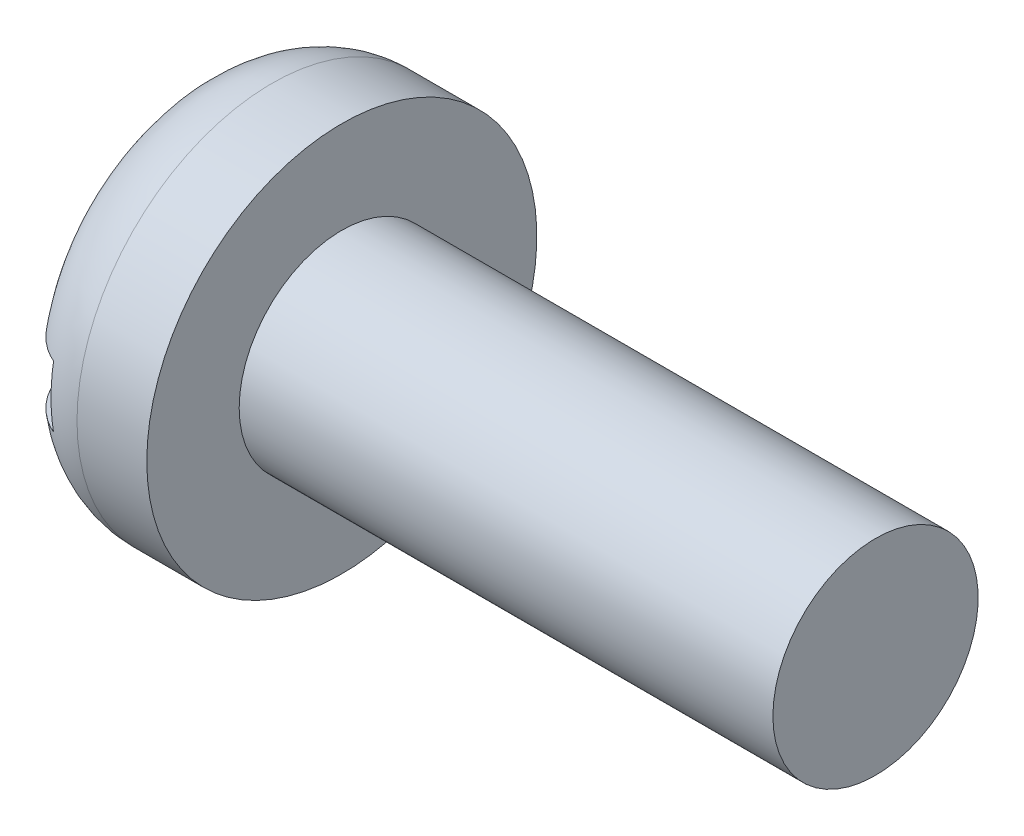
ISO-10303-21;
HEADER;
FILE_DESCRIPTION(('STEP AP214'),'2;1');
FILE_NAME('part.step','',(''),(''),'','','');
FILE_SCHEMA(('AUTOMOTIVE_DESIGN { 1 0 10303 214 1 1 1 1 }'));
ENDSEC;
DATA;
#1=APPLICATION_CONTEXT('core data for automotive mechanical design processes');
#2=APPLICATION_PROTOCOL_DEFINITION('international standard','automotive_design',2000,#1);
#3=PRODUCT_CONTEXT('',#1,'mechanical');
#4=PRODUCT('Part','Part','',(#3));
#5=PRODUCT_RELATED_PRODUCT_CATEGORY('part','',(#4));
#6=PRODUCT_DEFINITION_FORMATION('','',#4);
#7=PRODUCT_DEFINITION_CONTEXT('part definition',#1,'design');
#8=PRODUCT_DEFINITION('design','',#6,#7);
#9=PRODUCT_DEFINITION_SHAPE('','',#8);
#10=(LENGTH_UNIT() NAMED_UNIT(*) SI_UNIT(.MILLI.,.METRE.));
#11=(NAMED_UNIT(*) PLANE_ANGLE_UNIT() SI_UNIT($,.RADIAN.));
#12=(NAMED_UNIT(*) SI_UNIT($,.STERADIAN.) SOLID_ANGLE_UNIT());
#13=UNCERTAINTY_MEASURE_WITH_UNIT(LENGTH_MEASURE(1.E-05),#10,'distance_accuracy_value','');
#14=(GEOMETRIC_REPRESENTATION_CONTEXT(3) GLOBAL_UNCERTAINTY_ASSIGNED_CONTEXT((#13)) GLOBAL_UNIT_ASSIGNED_CONTEXT((#10,
#11,#12)) REPRESENTATION_CONTEXT('',''));
#15=CARTESIAN_POINT('',(0.,0.,0.));
#16=DIRECTION('',(0.,0.,1.));
#17=DIRECTION('',(1.,0.,0.));
#18=AXIS2_PLACEMENT_3D('',#15,#16,#17);
#19=CARTESIAN_POINT('',(-34.1560212530234,7.15217082981992,13.1645875920142));
#20=DIRECTION('',(-1.,0.,0.));
#21=DIRECTION('',(0.,0.,1.));
#22=AXIS2_PLACEMENT_3D('',#19,#20,#21);
#23=PLANE('',#22);
#24=DIRECTION('',(0.,0.,-1.));
#25=VECTOR('',#24,1.);
#26=CARTESIAN_POINT('',(-34.1560212530234,7.90217082981992,17.9145875920142));
#27=LINE('',#26,#25);
#28=CARTESIAN_POINT('',(-34.1560212530234,7.90217082981992,15.8103389030788));
#29=VERTEX_POINT('',#28);
#30=CARTESIAN_POINT('',(-34.1560212530234,7.90217082981992,10.5188362809496));
#31=VERTEX_POINT('',#30);
#32=EDGE_CURVE('E94',#29,#31,#27,.T.);
#33=ORIENTED_EDGE('',*,*,#32,.F.);
#34=CARTESIAN_POINT('',(-34.1560212530234,7.15217082981992,13.1645875920142));
#35=DIRECTION('',(-1.,0.,0.));
#36=DIRECTION('',(0.,0.,1.));
#37=AXIS2_PLACEMENT_3D('',#34,#35,#36);
#38=CIRCLE('',#37,2.75);
#39=EDGE_CURVE('E101',#29,#31,#38,.T.);
#40=ORIENTED_EDGE('',*,*,#39,.T.);
#41=EDGE_LOOP('',(#33,#40));
#42=FACE_BOUND('',#41,.T.);
#43=ADVANCED_FACE('F39',(#42),#23,.T.);
#44=CARTESIAN_POINT('',(-59.5560212530234,7.15217082981992,13.1645875920142));
#45=DIRECTION('',(-1.,0.,0.));
#46=DIRECTION('',(0.,0.,1.));
#47=AXIS2_PLACEMENT_3D('',#44,#45,#46);
#48=CYLINDRICAL_SURFACE('',#47,2.5);
#49=CARTESIAN_POINT('',(-17.4560212530234,7.15217082981992,13.1645875920142));
#50=DIRECTION('',(-1.,0.,0.));
#51=DIRECTION('',(0.,0.,1.));
#52=AXIS2_PLACEMENT_3D('',#49,#50,#51);
#53=CIRCLE('',#52,2.5);
#54=CARTESIAN_POINT('',(-17.4560212530234,7.15217082981992,15.6645875920142));
#55=VERTEX_POINT('',#54);
#56=EDGE_CURVE('E105',#55,#55,#53,.T.);
#57=ORIENTED_EDGE('',*,*,#56,.T.);
#58=EDGE_LOOP('',(#57));
#59=FACE_BOUND('',#58,.T.);
#60=CARTESIAN_POINT('',(-30.4560212530234,7.15217082981992,13.1645875920142));
#61=DIRECTION('',(-1.,0.,0.));
#62=DIRECTION('',(0.,0.,1.));
#63=AXIS2_PLACEMENT_3D('',#60,#61,#62);
#64=CIRCLE('',#63,2.5);
#65=CARTESIAN_POINT('',(-30.4560212530234,7.15217082981992,15.6645875920142));
#66=VERTEX_POINT('',#65);
#67=EDGE_CURVE('E174',#66,#66,#64,.T.);
#68=ORIENTED_EDGE('',*,*,#67,.F.);
#69=EDGE_LOOP('',(#68));
#70=FACE_BOUND('',#69,.T.);
#71=ADVANCED_FACE('F41',(#59,#70),#48,.T.);
#72=CARTESIAN_POINT('',(-17.4560212530234,9.65217082981992,13.1645875920142));
#73=DIRECTION('',(1.,0.,0.));
#74=DIRECTION('',(0.,0.,-1.));
#75=AXIS2_PLACEMENT_3D('',#72,#73,#74);
#76=PLANE('',#75);
#77=ORIENTED_EDGE('',*,*,#56,.F.);
#78=EDGE_LOOP('',(#77));
#79=FACE_BOUND('',#78,.T.);
#80=ADVANCED_FACE('F160',(#79),#76,.T.);
#81=DIRECTION('',(0.,0.,1.));
#82=VECTOR('',#81,1.);
#83=CARTESIAN_POINT('',(-34.1560212530234,6.40217082981992,8.41458759201424));
#84=LINE('',#83,#82);
#85=CARTESIAN_POINT('',(-34.1560212530234,6.40217082981992,10.5188362809497));
#86=VERTEX_POINT('',#85);
#87=CARTESIAN_POINT('',(-34.1560212530234,6.40217082981992,15.8103389030788));
#88=VERTEX_POINT('',#87);
#89=EDGE_CURVE('E85',#86,#88,#84,.T.);
#90=ORIENTED_EDGE('',*,*,#89,.F.);
#91=EDGE_CURVE('E92',#86,#88,#38,.T.);
#92=ORIENTED_EDGE('',*,*,#91,.T.);
#93=EDGE_LOOP('',(#90,#92));
#94=FACE_BOUND('',#93,.T.);
#95=ADVANCED_FACE('F91',(#94),#23,.T.);
#96=CARTESIAN_POINT('',(-32.1560212530234,7.15217082981992,13.1645875920142));
#97=DIRECTION('',(-1.,0.,0.));
#98=DIRECTION('',(0.,0.,1.));
#99=AXIS2_PLACEMENT_3D('',#96,#97,#98);
#100=TOROIDAL_SURFACE('',#99,2.75,2.);
#101=CARTESIAN_POINT('',(-32.1560212530234,7.90217082981992,13.1645875920142));
#102=CARTESIAN_POINT('',(-32.1585637933892,7.90217082981992,13.1630306328107));
#103=CARTESIAN_POINT('',(-32.1611063606378,7.90217082981992,13.1614736343376));
#104=CARTESIAN_POINT('',(-32.3775258735326,7.90217082981987,13.0289397618987));
#105=CARTESIAN_POINT('',(-32.5914875932781,7.90217082981991,12.8975372468939));
#106=CARTESIAN_POINT('',(-32.8990380550231,7.90217082981992,12.6812934608708));
#107=CARTESIAN_POINT('',(-32.9992240425318,7.90217082981992,12.6061117048243));
#108=CARTESIAN_POINT('',(-33.1925480933318,7.90217082981992,12.4472457905427));
#109=CARTESIAN_POINT('',(-33.2856925687357,7.90217082981992,12.363569534291));
#110=CARTESIAN_POINT('',(-33.4777345499212,7.90217082981992,12.1707137121062));
#111=CARTESIAN_POINT('',(-33.5747688275179,7.90217082981992,12.059636142358));
#112=CARTESIAN_POINT('',(-33.7505053794897,7.90217082981992,11.8235129442776));
#113=CARTESIAN_POINT('',(-33.8291958368805,7.90217082981992,11.698458388358));
#114=CARTESIAN_POINT('',(-33.964086279289,7.90217082981992,11.4352870494449));
#115=CARTESIAN_POINT('',(-34.0200950377302,7.90217082981992,11.2970708646883));
#116=CARTESIAN_POINT('',(-34.1046798733994,7.90217082981992,11.012434329591));
#117=CARTESIAN_POINT('',(-34.1332737178728,7.90217082981992,10.8660193579953));
#118=CARTESIAN_POINT('',(-34.1589088663038,7.90217082981992,10.5870706758641));
#119=CARTESIAN_POINT('',(-34.1591369045153,7.90217082981992,10.4548276022557));
#120=CARTESIAN_POINT('',(-34.1351518645423,7.90217082981992,10.1925638392498));
#121=CARTESIAN_POINT('',(-34.1109506047191,7.90217082981992,10.062542106147));
#122=CARTESIAN_POINT('',(-34.0416030051228,7.90217082981992,9.82055508940338));
#123=CARTESIAN_POINT('',(-33.9984809331208,7.90217082981992,9.70800652510776));
#124=CARTESIAN_POINT('',(-33.8931714110885,7.90217082981992,9.49221976469486));
#125=CARTESIAN_POINT('',(-33.8309905453412,7.90217082981992,9.3889783691255));
#126=CARTESIAN_POINT('',(-33.6922033397545,7.90217082981992,9.19912243556574));
#127=CARTESIAN_POINT('',(-33.616288795508,7.90217082981992,9.11200149619686));
#128=CARTESIAN_POINT('',(-33.4506285237545,7.90217082981992,8.95207081496302));
#129=CARTESIAN_POINT('',(-33.3608835193194,7.90217082981992,8.87926032538432));
#130=CARTESIAN_POINT('',(-33.1721453795432,7.90217082981992,8.7515582473592));
#131=CARTESIAN_POINT('',(-33.0733813136964,7.90217082981992,8.69632788160799));
#132=CARTESIAN_POINT('',(-32.8679279969552,7.90217082981992,8.60344440225547));
#133=CARTESIAN_POINT('',(-32.7612406029192,7.90217082981992,8.56578718530114));
#134=CARTESIAN_POINT('',(-32.5441651705313,7.90217082981992,8.50947895546948));
#135=CARTESIAN_POINT('',(-32.433828084167,7.90217082981992,8.49063150951292));
#136=CARTESIAN_POINT('',(-32.2115463631959,7.90217082981992,8.47180212956621));
#137=CARTESIAN_POINT('',(-32.0996014275652,7.90217082981992,8.47182377555441));
#138=CARTESIAN_POINT('',(-31.8777751021335,7.90217082981992,8.49072301837474));
#139=CARTESIAN_POINT('',(-31.7678866268686,7.90217082981992,8.50951456950833));
#140=CARTESIAN_POINT('',(-31.6066491535148,7.90217082981992,8.55128177717353));
#141=CARTESIAN_POINT('',(-31.5534620316616,7.90217082981992,8.56748563534195));
#142=CARTESIAN_POINT('',(-31.448634863689,7.90217082981992,8.60430445625569));
#143=CARTESIAN_POINT('',(-31.396994872624,7.90217082981992,8.62491957576286));
#144=CARTESIAN_POINT('',(-31.3462885975344,7.90217082981992,8.64767849982155));
#145=B_SPLINE_CURVE_WITH_KNOTS('',3,(#101,#102,#103,#104,#105,#106,#107,#108,#109,#110,#111,
#112,#113,#114,#115,#116,#117,#118,#119,#120,#121,#122,#123,#124,#125,#126,#127,#128,#129,#130,
#131,#132,#133,#134,#135,#136,#137,#138,#139,#140,#141,#142,#143,#144),.UNSPECIFIED.,.F.,.F.,(4,
2,2,2,2,2,2,2,2,2,2,2,2,2,2,2,2,2,2,2,2,4),(0.,0.00894427191004238,0.76131942963517,
1.13671453952374,1.51176358473608,1.95268955931189,2.3938987957597,2.83875402308001,
3.28332075030153,3.67789205033982,4.07227255683468,4.43204639630518,4.79169608375181,
5.13667709031289,5.4816400669968,5.81948418397834,6.15724937439949,6.49144912103186,
6.82571227443123,7.15845008678029,7.32508190046574,7.49171963668609),.UNSPECIFIED.);
#146=CARTESIAN_POINT('',(-32.9560212530234,7.90217082981992,8.64334146634238));
#147=VERTEX_POINT('',#146);
#148=EDGE_CURVE('E11',#31,#147,#145,.T.);
#149=ORIENTED_EDGE('',*,*,#148,.F.);
#150=ORIENTED_EDGE('',*,*,#39,.F.);
#151=CARTESIAN_POINT('',(-32.1560212530234,7.90217082981992,13.1645875920142));
#152=CARTESIAN_POINT('',(-32.1585637933892,7.90217082981992,13.1661445512177));
#153=CARTESIAN_POINT('',(-32.1611063606378,7.90217082981992,13.1677015496909));
#154=CARTESIAN_POINT('',(-32.3775258735326,7.90217082981987,13.3002354221298));
#155=CARTESIAN_POINT('',(-32.5914875932781,7.90217082981991,13.4316379371346));
#156=CARTESIAN_POINT('',(-32.8990380550231,7.90217082981992,13.6478817231577));
#157=CARTESIAN_POINT('',(-32.9992240425318,7.90217082981992,13.7230634792041));
#158=CARTESIAN_POINT('',(-33.1925480933319,7.90217082981992,13.8819293934858));
#159=CARTESIAN_POINT('',(-33.2856925687357,7.90217082981992,13.9656056497375));
#160=CARTESIAN_POINT('',(-33.4777345499212,7.90217082981992,14.1584614719223));
#161=CARTESIAN_POINT('',(-33.5747688275179,7.90217082981992,14.2695390416704));
#162=CARTESIAN_POINT('',(-33.7505053794897,7.90217082981992,14.5056622397508));
#163=CARTESIAN_POINT('',(-33.8291958368805,7.90217082981992,14.6307167956704));
#164=CARTESIAN_POINT('',(-33.964086279289,7.90217082981992,14.8938881345835));
#165=CARTESIAN_POINT('',(-34.0200950377302,7.90217082981992,15.0321043193402));
#166=CARTESIAN_POINT('',(-34.1046798733994,7.90217082981992,15.3167408544375));
#167=CARTESIAN_POINT('',(-34.1332737178728,7.90217082981992,15.4631558260332));
#168=CARTESIAN_POINT('',(-34.1589088663038,7.90217082981992,15.7421045081644));
#169=CARTESIAN_POINT('',(-34.1591369045153,7.90217082981992,15.8743475817727));
#170=CARTESIAN_POINT('',(-34.1351518645423,7.90217082981992,16.1366113447787));
#171=CARTESIAN_POINT('',(-34.1109506047191,7.90217082981992,16.2666330778815));
#172=CARTESIAN_POINT('',(-34.0416030051228,7.90217082981992,16.5086200946251));
#173=CARTESIAN_POINT('',(-33.9984809331208,7.90217082981992,16.6211686589207));
#174=CARTESIAN_POINT('',(-33.8931714110885,7.90217082981992,16.8369554193336));
#175=CARTESIAN_POINT('',(-33.8309905453412,7.90217082981992,16.940196814903));
#176=CARTESIAN_POINT('',(-33.6922033397545,7.90217082981992,17.1300527484627));
#177=CARTESIAN_POINT('',(-33.616288795508,7.90217082981992,17.2171736878316));
#178=CARTESIAN_POINT('',(-33.4506285237545,7.90217082981992,17.3771043690655));
#179=CARTESIAN_POINT('',(-33.3608835193194,7.90217082981992,17.4499148586442));
#180=CARTESIAN_POINT('',(-33.1721453795432,7.90217082981992,17.5776169366693));
#181=CARTESIAN_POINT('',(-33.0733813136964,7.90217082981992,17.6328473024205));
#182=CARTESIAN_POINT('',(-32.8679279969552,7.90217082981992,17.725730781773));
#183=CARTESIAN_POINT('',(-32.7612406029192,7.90217082981992,17.7633879987273));
#184=CARTESIAN_POINT('',(-32.5441651705313,7.90217082981992,17.819696228559));
#185=CARTESIAN_POINT('',(-32.433828084167,7.90217082981992,17.8385436745156));
#186=CARTESIAN_POINT('',(-32.2115463631959,7.90217082981992,17.8573730544623));
#187=CARTESIAN_POINT('',(-32.0996014275652,7.90217082981992,17.8573514084741));
#188=CARTESIAN_POINT('',(-31.8777751021335,7.90217082981992,17.8384521656537));
#189=CARTESIAN_POINT('',(-31.7678866268686,7.90217082981992,17.8196606145202));
#190=CARTESIAN_POINT('',(-31.6066491535148,7.90217082981992,17.777893406855));
#191=CARTESIAN_POINT('',(-31.5534620316616,7.90217082981992,17.7616895486865));
#192=CARTESIAN_POINT('',(-31.448634863689,7.90217082981992,17.7248707277728));
#193=CARTESIAN_POINT('',(-31.396994872624,7.90217082981992,17.7042556082656));
#194=CARTESIAN_POINT('',(-31.3462885975344,7.90217082981992,17.6814966842069));
#195=B_SPLINE_CURVE_WITH_KNOTS('',3,(#151,#152,#153,#154,#155,#156,#157,#158,#159,#160,#161,
#162,#163,#164,#165,#166,#167,#168,#169,#170,#171,#172,#173,#174,#175,#176,#177,#178,#179,#180,
#181,#182,#183,#184,#185,#186,#187,#188,#189,#190,#191,#192,#193,#194),.UNSPECIFIED.,.F.,.F.,(4,
2,2,2,2,2,2,2,2,2,2,2,2,2,2,2,2,2,2,2,2,4),(0.,0.00894427191004238,0.76131942963517,
1.13671453952375,1.51176358473608,1.95268955931189,2.3938987957597,2.83875402308001,
3.28332075030153,3.67789205033982,4.07227255683468,4.43204639630519,4.79169608375181,
5.13667709031289,5.4816400669968,5.81948418397834,6.15724937439949,6.49144912103186,
6.82571227443123,7.1584500867803,7.32508190046574,7.49171963668609),.UNSPECIFIED.);
#196=CARTESIAN_POINT('',(-32.9560212530234,7.90217082981992,17.6858337176861));
#197=VERTEX_POINT('',#196);
#198=EDGE_CURVE('E121',#197,#29,#195,.F.);
#199=ORIENTED_EDGE('',*,*,#198,.F.);
#200=CARTESIAN_POINT('',(-32.9560212530234,7.15217082981992,13.1645875920142));
#201=DIRECTION('',(-1.,0.,0.));
#202=DIRECTION('',(0.,0.,1.));
#203=AXIS2_PLACEMENT_3D('',#200,#201,#202);
#204=CIRCLE('',#203,4.58303027798234);
#205=CARTESIAN_POINT('',(-32.9560212530234,6.40217082981992,17.6858337176861));
#206=VERTEX_POINT('',#205);
#207=EDGE_CURVE('E113',#197,#206,#204,.F.);
#208=ORIENTED_EDGE('',*,*,#207,.T.);
#209=CARTESIAN_POINT('',(-32.1560212530234,6.40217082981992,13.1645875920142));
#210=CARTESIAN_POINT('',(-32.1585637933892,6.40217082981992,13.1661445512177));
#211=CARTESIAN_POINT('',(-32.1611063606378,6.40217082981992,13.1677015496908));
#212=CARTESIAN_POINT('',(-32.3775258735338,6.40217082981992,13.3002354221273));
#213=CARTESIAN_POINT('',(-32.5914875932778,6.40217082981992,13.4316379371339));
#214=CARTESIAN_POINT('',(-32.8990380550222,6.40217082981992,13.6478817231574));
#215=CARTESIAN_POINT('',(-32.999224042531,6.40217082981992,13.7230634792036));
#216=CARTESIAN_POINT('',(-33.192548093331,6.40217082981992,13.881929393485));
#217=CARTESIAN_POINT('',(-33.2856925687348,6.40217082981992,13.9656056497366));
#218=CARTESIAN_POINT('',(-33.4777345499203,6.40217082981992,14.1584614719214));
#219=CARTESIAN_POINT('',(-33.5747688275172,6.40217082981992,14.2695390416695));
#220=CARTESIAN_POINT('',(-33.7505053794891,6.40217082981992,14.5056622397499));
#221=CARTESIAN_POINT('',(-33.8291958368799,6.40217082981992,14.6307167956695));
#222=CARTESIAN_POINT('',(-33.9640862792886,6.40217082981992,14.8938881345826));
#223=CARTESIAN_POINT('',(-34.0200950377298,6.40217082981992,15.0321043193392));
#224=CARTESIAN_POINT('',(-34.1046798733992,6.40217082981992,15.3167408544366));
#225=CARTESIAN_POINT('',(-34.1332737178726,6.40217082981992,15.4631558260324));
#226=CARTESIAN_POINT('',(-34.1589088663037,6.40217082981992,15.7421045081636));
#227=CARTESIAN_POINT('',(-34.1591369045153,6.40217082981992,15.874347581772));
#228=CARTESIAN_POINT('',(-34.1351518645424,6.40217082981992,16.136611344778));
#229=CARTESIAN_POINT('',(-34.1109506047192,6.40217082981992,16.2666330778809));
#230=CARTESIAN_POINT('',(-34.041603005123,6.40217082981992,16.5086200946245));
#231=CARTESIAN_POINT('',(-33.998480933121,6.40217082981992,16.6211686589201));
#232=CARTESIAN_POINT('',(-33.8931714110888,6.40217082981992,16.8369554193331));
#233=CARTESIAN_POINT('',(-33.8309905453416,6.40217082981992,16.9401968149025));
#234=CARTESIAN_POINT('',(-33.6922033397549,6.40217082981992,17.1300527484623));
#235=CARTESIAN_POINT('',(-33.6162887955084,6.40217082981992,17.2171736878312));
#236=CARTESIAN_POINT('',(-33.4506285237549,6.40217082981992,17.3771043690651));
#237=CARTESIAN_POINT('',(-33.3608835193199,6.40217082981992,17.4499148586438));
#238=CARTESIAN_POINT('',(-33.1721453795437,6.40217082981992,17.577616936669));
#239=CARTESIAN_POINT('',(-33.0733813136969,6.40217082981992,17.6328473024202));
#240=CARTESIAN_POINT('',(-32.8679279969557,6.40217082981992,17.7257307817728));
#241=CARTESIAN_POINT('',(-32.7612406029197,6.40217082981992,17.7633879987272));
#242=CARTESIAN_POINT('',(-32.5441651705319,6.40217082981992,17.8196962285589));
#243=CARTESIAN_POINT('',(-32.4338280841676,6.40217082981992,17.8385436745155));
#244=CARTESIAN_POINT('',(-32.2115463631964,6.40217082981992,17.8573730544623));
#245=CARTESIAN_POINT('',(-32.0996014275658,6.40217082981992,17.8573514084741));
#246=CARTESIAN_POINT('',(-31.8777751021341,6.40217082981992,17.8384521656538));
#247=CARTESIAN_POINT('',(-31.7678866268691,6.40217082981992,17.8196606145203));
#248=CARTESIAN_POINT('',(-31.6066491535154,6.40217082981992,17.7778934068551));
#249=CARTESIAN_POINT('',(-31.5534620316621,6.40217082981992,17.7616895486867));
#250=CARTESIAN_POINT('',(-31.4486348636895,6.40217082981992,17.724870727773));
#251=CARTESIAN_POINT('',(-31.3969948726245,6.40217082981992,17.7042556082658));
#252=CARTESIAN_POINT('',(-31.3462885975349,6.40217082981992,17.6814966842072));
#253=B_SPLINE_CURVE_WITH_KNOTS('',3,(#209,#210,#211,#212,#213,#214,#215,#216,#217,#218,#219,
#220,#221,#222,#223,#224,#225,#226,#227,#228,#229,#230,#231,#232,#233,#234,#235,#236,#237,#238,
#239,#240,#241,#242,#243,#244,#245,#246,#247,#248,#249,#250,#251,#252),.UNSPECIFIED.,.F.,.F.,(4,
2,2,2,2,2,2,2,2,2,2,2,2,2,2,2,2,2,2,2,2,4),(0.,0.00894427191004122,0.761319429634323,
1.13671453952267,1.51176358473469,1.95268955931076,2.39389879575862,2.83875402307904,
3.28332075030079,3.67789205033914,4.07227255683405,4.43204639630457,4.79169608375121,
5.13667709031231,5.48164006699623,5.81948418397778,6.15724937439892,6.4914491210313,
6.82571227443066,7.15845008677973,7.32508190046519,7.49171963668553),.UNSPECIFIED.);
#254=EDGE_CURVE('E100',#88,#206,#253,.T.);
#255=ORIENTED_EDGE('',*,*,#254,.F.);
#256=ORIENTED_EDGE('',*,*,#91,.F.);
#257=CARTESIAN_POINT('',(-32.1560212530234,6.40217082981992,13.1645875920142));
#258=CARTESIAN_POINT('',(-32.1585637933892,6.40217082981992,13.1630306328108));
#259=CARTESIAN_POINT('',(-32.1611063606378,6.40217082981992,13.1614736343377));
#260=CARTESIAN_POINT('',(-32.3775258735338,6.40217082981992,13.0289397619012));
#261=CARTESIAN_POINT('',(-32.5914875932778,6.40217082981992,12.8975372468946));
#262=CARTESIAN_POINT('',(-32.8990380550222,6.40217082981992,12.6812934608711));
#263=CARTESIAN_POINT('',(-32.999224042531,6.40217082981992,12.6061117048249));
#264=CARTESIAN_POINT('',(-33.192548093331,6.40217082981992,12.4472457905435));
#265=CARTESIAN_POINT('',(-33.2856925687348,6.40217082981992,12.3635695342919));
#266=CARTESIAN_POINT('',(-33.4777345499203,6.40217082981992,12.1707137121071));
#267=CARTESIAN_POINT('',(-33.5747688275172,6.40217082981992,12.059636142359));
#268=CARTESIAN_POINT('',(-33.7505053794891,6.40217082981992,11.8235129442786));
#269=CARTESIAN_POINT('',(-33.8291958368799,6.40217082981992,11.698458388359));
#270=CARTESIAN_POINT('',(-33.9640862792886,6.40217082981992,11.4352870494459));
#271=CARTESIAN_POINT('',(-34.0200950377298,6.40217082981992,11.2970708646893));
#272=CARTESIAN_POINT('',(-34.1046798733992,6.40217082981992,11.0124343295919));
#273=CARTESIAN_POINT('',(-34.1332737178726,6.40217082981992,10.8660193579961));
#274=CARTESIAN_POINT('',(-34.1589088663037,6.40217082981992,10.5870706758649));
#275=CARTESIAN_POINT('',(-34.1591369045153,6.40217082981992,10.4548276022564));
#276=CARTESIAN_POINT('',(-34.1351518645424,6.40217082981992,10.1925638392504));
#277=CARTESIAN_POINT('',(-34.1109506047192,6.40217082981992,10.0625421061476));
#278=CARTESIAN_POINT('',(-34.041603005123,6.40217082981992,9.82055508940397));
#279=CARTESIAN_POINT('',(-33.998480933121,6.40217082981992,9.70800652510833));
#280=CARTESIAN_POINT('',(-33.8931714110888,6.40217082981992,9.49221976469539));
#281=CARTESIAN_POINT('',(-33.8309905453416,6.40217082981992,9.38897836912601));
#282=CARTESIAN_POINT('',(-33.6922033397549,6.40217082981992,9.1991224355662));
#283=CARTESIAN_POINT('',(-33.6162887955084,6.40217082981992,9.11200149619729));
#284=CARTESIAN_POINT('',(-33.4506285237549,6.40217082981992,8.9520708149634));
#285=CARTESIAN_POINT('',(-33.3608835193199,6.40217082981992,8.87926032538468));
#286=CARTESIAN_POINT('',(-33.1721453795437,6.40217082981992,8.7515582473595));
#287=CARTESIAN_POINT('',(-33.0733813136969,6.40217082981992,8.69632788160826));
#288=CARTESIAN_POINT('',(-32.8679279969557,6.40217082981992,8.60344440225568));
#289=CARTESIAN_POINT('',(-32.7612406029197,6.40217082981992,8.56578718530131));
#290=CARTESIAN_POINT('',(-32.5441651705319,6.40217082981992,8.50947895546959));
#291=CARTESIAN_POINT('',(-32.4338280841676,6.40217082981992,8.490631509513));
#292=CARTESIAN_POINT('',(-32.2115463631964,6.40217082981992,8.47180212956623));
#293=CARTESIAN_POINT('',(-32.0996014275658,6.40217082981992,8.47182377555439));
#294=CARTESIAN_POINT('',(-31.8777751021341,6.40217082981992,8.49072301837466));
#295=CARTESIAN_POINT('',(-31.7678866268691,6.40217082981992,8.50951456950822));
#296=CARTESIAN_POINT('',(-31.6066491535154,6.40217082981992,8.55128177717338));
#297=CARTESIAN_POINT('',(-31.5534620316621,6.40217082981992,8.56748563534178));
#298=CARTESIAN_POINT('',(-31.4486348636895,6.40217082981992,8.60430445625549));
#299=CARTESIAN_POINT('',(-31.3969948726245,6.40217082981992,8.62491957576264));
#300=CARTESIAN_POINT('',(-31.3462885975349,6.40217082981992,8.64767849982132));
#301=B_SPLINE_CURVE_WITH_KNOTS('',3,(#257,#258,#259,#260,#261,#262,#263,#264,#265,#266,#267,
#268,#269,#270,#271,#272,#273,#274,#275,#276,#277,#278,#279,#280,#281,#282,#283,#284,#285,#286,
#287,#288,#289,#290,#291,#292,#293,#294,#295,#296,#297,#298,#299,#300),.UNSPECIFIED.,.F.,.F.,(4,
2,2,2,2,2,2,2,2,2,2,2,2,2,2,2,2,2,2,2,2,4),(0.,0.00894427191004122,0.761319429634324,
1.13671453952267,1.51176358473469,1.95268955931077,2.39389879575862,2.83875402307904,
3.28332075030079,3.67789205033915,4.07227255683405,4.43204639630457,4.79169608375121,
5.13667709031231,5.48164006699623,5.81948418397778,6.15724937439892,6.4914491210313,
6.82571227443066,7.15845008677973,7.32508190046519,7.49171963668553),.UNSPECIFIED.);
#302=CARTESIAN_POINT('',(-32.9560212530234,6.40217082981992,8.64334146634238));
#303=VERTEX_POINT('',#302);
#304=EDGE_CURVE('E53',#303,#86,#301,.F.);
#305=ORIENTED_EDGE('',*,*,#304,.F.);
#306=EDGE_CURVE('E65',#303,#147,#204,.F.);
#307=ORIENTED_EDGE('',*,*,#306,.T.);
#308=EDGE_LOOP('',(#149,#150,#199,#208,#255,#256,#305,#307));
#309=FACE_BOUND('',#308,.T.);
#310=CARTESIAN_POINT('',(-32.1560212530234,7.15217082981992,13.1645875920142));
#311=DIRECTION('',(-1.,0.,0.));
#312=DIRECTION('',(0.,0.,1.));
#313=AXIS2_PLACEMENT_3D('',#310,#311,#312);
#314=CIRCLE('',#313,4.75);
#315=CARTESIAN_POINT('',(-32.1560212530234,7.15217082981992,17.9145875920142));
#316=VERTEX_POINT('',#315);
#317=EDGE_CURVE('E102',#316,#316,#314,.T.);
#318=ORIENTED_EDGE('',*,*,#317,.T.);
#319=EDGE_LOOP('',(#318));
#320=FACE_BOUND('',#319,.T.);
#321=ADVANCED_FACE('F97',(#309,#320),#100,.T.);
#322=CARTESIAN_POINT('',(-59.5560212530234,7.15217082981992,13.1645875920142));
#323=DIRECTION('',(-1.,0.,0.));
#324=DIRECTION('',(0.,0.,1.));
#325=AXIS2_PLACEMENT_3D('',#322,#323,#324);
#326=CYLINDRICAL_SURFACE('',#325,4.75);
#327=CARTESIAN_POINT('',(-30.4560212530234,7.15217082981992,13.1645875920142));
#328=DIRECTION('',(-1.,0.,0.));
#329=DIRECTION('',(0.,0.,1.));
#330=AXIS2_PLACEMENT_3D('',#327,#328,#329);
#331=CIRCLE('',#330,4.75);
#332=CARTESIAN_POINT('',(-30.4560212530234,7.15217082981992,17.9145875920142));
#333=VERTEX_POINT('',#332);
#334=EDGE_CURVE('E107',#333,#333,#331,.T.);
#335=ORIENTED_EDGE('',*,*,#334,.T.);
#336=EDGE_LOOP('',(#335));
#337=FACE_BOUND('',#336,.T.);
#338=ORIENTED_EDGE('',*,*,#317,.F.);
#339=EDGE_LOOP('',(#338));
#340=FACE_BOUND('',#339,.T.);
#341=ADVANCED_FACE('F146',(#337,#340),#326,.T.);
#342=CARTESIAN_POINT('',(-30.4560212530234,9.65217082981992,13.1645875920142));
#343=DIRECTION('',(-1.,0.,0.));
#344=DIRECTION('',(0.,0.,1.));
#345=AXIS2_PLACEMENT_3D('',#342,#343,#344);
#346=PLANE('',#345);
#347=ORIENTED_EDGE('',*,*,#334,.F.);
#348=EDGE_LOOP('',(#347));
#349=FACE_BOUND('',#348,.T.);
#350=ORIENTED_EDGE('',*,*,#67,.T.);
#351=EDGE_LOOP('',(#350));
#352=FACE_BOUND('',#351,.T.);
#353=ADVANCED_FACE('F142',(#349,#352),#346,.F.);
#354=CARTESIAN_POINT('',(-32.9560212530234,7.90217082981992,17.9145875920142));
#355=DIRECTION('',(0.,1.,0.));
#356=DIRECTION('',(0.,0.,1.));
#357=AXIS2_PLACEMENT_3D('',#354,#355,#356);
#358=PLANE('',#357);
#359=ORIENTED_EDGE('',*,*,#148,.T.);
#360=DIRECTION('',(0.,0.,-1.));
#361=VECTOR('',#360,1.);
#362=CARTESIAN_POINT('',(-32.9560212530234,7.90217082981992,17.9145875920142));
#363=LINE('',#362,#361);
#364=EDGE_CURVE('E93',#197,#147,#363,.T.);
#365=ORIENTED_EDGE('',*,*,#364,.F.);
#366=ORIENTED_EDGE('',*,*,#198,.T.);
#367=ORIENTED_EDGE('',*,*,#32,.T.);
#368=EDGE_LOOP('',(#359,#365,#366,#367));
#369=FACE_BOUND('',#368,.T.);
#370=ADVANCED_FACE('F133',(#369),#358,.F.);
#371=CARTESIAN_POINT('',(-32.9560212530234,6.40217082981992,8.41458759201424));
#372=DIRECTION('',(0.,-1.,0.));
#373=DIRECTION('',(0.,0.,-1.));
#374=AXIS2_PLACEMENT_3D('',#371,#372,#373);
#375=PLANE('',#374);
#376=ORIENTED_EDGE('',*,*,#254,.T.);
#377=DIRECTION('',(0.,0.,1.));
#378=VECTOR('',#377,1.);
#379=CARTESIAN_POINT('',(-32.9560212530234,6.40217082981992,8.41458759201424));
#380=LINE('',#379,#378);
#381=EDGE_CURVE('E60',#303,#206,#380,.T.);
#382=ORIENTED_EDGE('',*,*,#381,.F.);
#383=ORIENTED_EDGE('',*,*,#304,.T.);
#384=ORIENTED_EDGE('',*,*,#89,.T.);
#385=EDGE_LOOP('',(#376,#382,#383,#384));
#386=FACE_BOUND('',#385,.T.);
#387=ADVANCED_FACE('F84',(#386),#375,.F.);
#388=CARTESIAN_POINT('',(-32.9560212530234,7.90217082981992,8.41458759201424));
#389=DIRECTION('',(-1.,0.,0.));
#390=DIRECTION('',(0.,0.,1.));
#391=AXIS2_PLACEMENT_3D('',#388,#389,#390);
#392=PLANE('',#391);
#393=ORIENTED_EDGE('',*,*,#381,.T.);
#394=ORIENTED_EDGE('',*,*,#207,.F.);
#395=ORIENTED_EDGE('',*,*,#364,.T.);
#396=ORIENTED_EDGE('',*,*,#306,.F.);
#397=EDGE_LOOP('',(#393,#394,#395,#396));
#398=FACE_BOUND('',#397,.T.);
#399=ADVANCED_FACE('F132',(#398),#392,.T.);
#400=CLOSED_SHELL('',(#43,#71,#80,#95,#321,#341,#353,#370,#387,#399));
#401=MANIFOLD_SOLID_BREP('B2',#400);
#402=ADVANCED_BREP_SHAPE_REPRESENTATION('',(#18,#401),#14);
#403=SHAPE_DEFINITION_REPRESENTATION(#9,#402);
ENDSEC;
END-ISO-10303-21;
